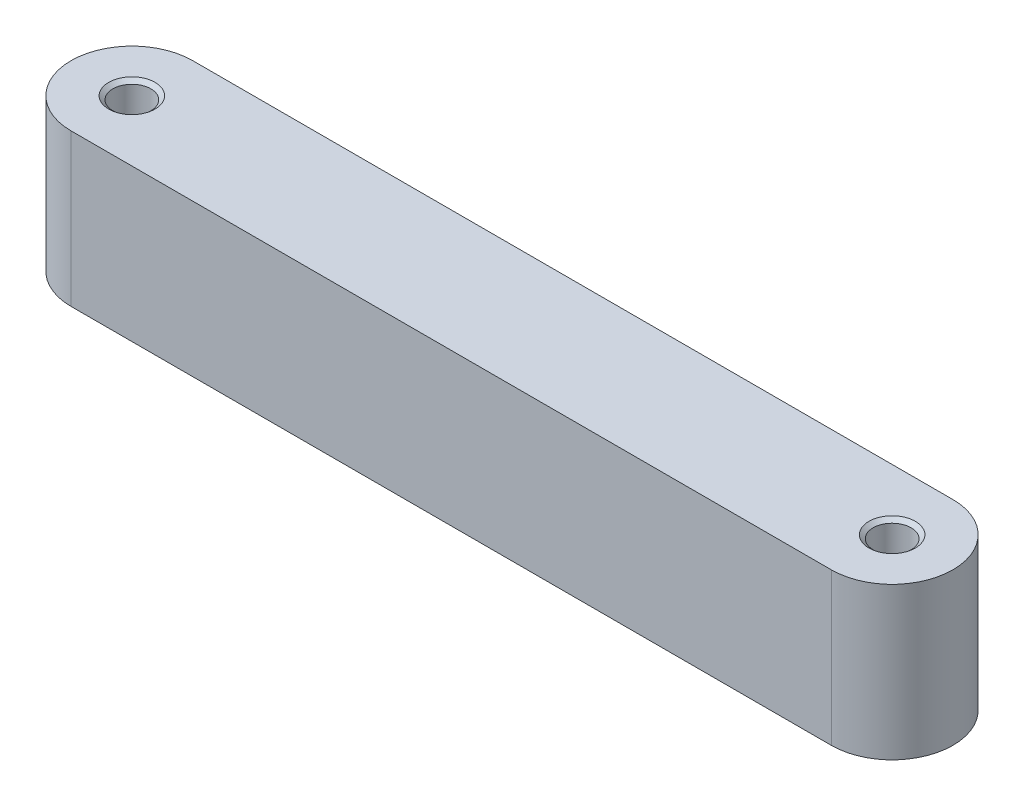
ISO-10303-21;
HEADER;
FILE_DESCRIPTION(('STEP AP214'),'2;1');
FILE_NAME('part.step','',(''),(''),'','','');
FILE_SCHEMA(('AUTOMOTIVE_DESIGN { 1 0 10303 214 1 1 1 1 }'));
ENDSEC;
DATA;
#1=APPLICATION_CONTEXT('core data for automotive mechanical design processes');
#2=APPLICATION_PROTOCOL_DEFINITION('international standard','automotive_design',2000,#1);
#3=PRODUCT_CONTEXT('',#1,'mechanical');
#4=PRODUCT('Part','Part','',(#3));
#5=PRODUCT_RELATED_PRODUCT_CATEGORY('part','',(#4));
#6=PRODUCT_DEFINITION_FORMATION('','',#4);
#7=PRODUCT_DEFINITION_CONTEXT('part definition',#1,'design');
#8=PRODUCT_DEFINITION('design','',#6,#7);
#9=PRODUCT_DEFINITION_SHAPE('','',#8);
#10=(LENGTH_UNIT() NAMED_UNIT(*) SI_UNIT(.MILLI.,.METRE.));
#11=(NAMED_UNIT(*) PLANE_ANGLE_UNIT() SI_UNIT($,.RADIAN.));
#12=(NAMED_UNIT(*) SI_UNIT($,.STERADIAN.) SOLID_ANGLE_UNIT());
#13=UNCERTAINTY_MEASURE_WITH_UNIT(LENGTH_MEASURE(1.E-05),#10,'distance_accuracy_value','');
#14=(GEOMETRIC_REPRESENTATION_CONTEXT(3) GLOBAL_UNCERTAINTY_ASSIGNED_CONTEXT((#13)) GLOBAL_UNIT_ASSIGNED_CONTEXT((#10,
#11,#12)) REPRESENTATION_CONTEXT('',''));
#15=CARTESIAN_POINT('',(0.,0.,0.));
#16=DIRECTION('',(0.,0.,1.));
#17=DIRECTION('',(1.,0.,0.));
#18=AXIS2_PLACEMENT_3D('',#15,#16,#17);
#19=CARTESIAN_POINT('',(-25.,10.,0.));
#20=DIRECTION('',(0.,-1.,0.));
#21=DIRECTION('',(0.,0.,-1.));
#22=AXIS2_PLACEMENT_3D('',#19,#20,#21);
#23=CYLINDRICAL_SURFACE('',#22,4.);
#24=CARTESIAN_POINT('',(-25.,0.,0.));
#25=DIRECTION('',(0.,1.,0.));
#26=DIRECTION('',(0.,0.,1.));
#27=AXIS2_PLACEMENT_3D('',#24,#25,#26);
#28=CIRCLE('',#27,4.);
#29=CARTESIAN_POINT('',(-25.,0.,-4.));
#30=VERTEX_POINT('',#29);
#31=CARTESIAN_POINT('',(-25.,0.,4.));
#32=VERTEX_POINT('',#31);
#33=EDGE_CURVE('E117',#30,#32,#28,.T.);
#34=ORIENTED_EDGE('',*,*,#33,.T.);
#35=DIRECTION('',(0.,-1.,0.));
#36=VECTOR('',#35,1.);
#37=CARTESIAN_POINT('',(-25.,10.,4.));
#38=LINE('',#37,#36);
#39=CARTESIAN_POINT('',(-25.,10.,4.));
#40=VERTEX_POINT('',#39);
#41=EDGE_CURVE('E11',#40,#32,#38,.T.);
#42=ORIENTED_EDGE('',*,*,#41,.F.);
#43=CARTESIAN_POINT('',(-25.,10.,0.));
#44=DIRECTION('',(0.,1.,0.));
#45=DIRECTION('',(0.,0.,1.));
#46=AXIS2_PLACEMENT_3D('',#43,#44,#45);
#47=CIRCLE('',#46,4.);
#48=CARTESIAN_POINT('',(-25.,10.,-4.));
#49=VERTEX_POINT('',#48);
#50=EDGE_CURVE('E101',#49,#40,#47,.T.);
#51=ORIENTED_EDGE('',*,*,#50,.F.);
#52=DIRECTION('',(0.,-1.,0.));
#53=VECTOR('',#52,1.);
#54=CARTESIAN_POINT('',(-25.,10.,-4.));
#55=LINE('',#54,#53);
#56=EDGE_CURVE('E113',#49,#30,#55,.T.);
#57=ORIENTED_EDGE('',*,*,#56,.T.);
#58=EDGE_LOOP('',(#34,#42,#51,#57));
#59=FACE_BOUND('',#58,.T.);
#60=ADVANCED_FACE('F49',(#59),#23,.T.);
#61=CARTESIAN_POINT('',(-25.,10.,4.));
#62=DIRECTION('',(0.,0.,-1.));
#63=DIRECTION('',(-1.,0.,0.));
#64=AXIS2_PLACEMENT_3D('',#61,#62,#63);
#65=PLANE('',#64);
#66=DIRECTION('',(1.,0.,0.));
#67=VECTOR('',#66,1.);
#68=CARTESIAN_POINT('',(-25.,0.,4.));
#69=LINE('',#68,#67);
#70=CARTESIAN_POINT('',(25.,0.,4.));
#71=VERTEX_POINT('',#70);
#72=EDGE_CURVE('E106',#32,#71,#69,.T.);
#73=ORIENTED_EDGE('',*,*,#72,.T.);
#74=DIRECTION('',(0.,-1.,0.));
#75=VECTOR('',#74,1.);
#76=CARTESIAN_POINT('',(25.,10.,4.));
#77=LINE('',#76,#75);
#78=CARTESIAN_POINT('',(25.,10.,4.));
#79=VERTEX_POINT('',#78);
#80=EDGE_CURVE('E58',#79,#71,#77,.T.);
#81=ORIENTED_EDGE('',*,*,#80,.F.);
#82=DIRECTION('',(1.,0.,0.));
#83=VECTOR('',#82,1.);
#84=CARTESIAN_POINT('',(-25.,10.,4.));
#85=LINE('',#84,#83);
#86=EDGE_CURVE('E96',#40,#79,#85,.T.);
#87=ORIENTED_EDGE('',*,*,#86,.F.);
#88=ORIENTED_EDGE('',*,*,#41,.T.);
#89=EDGE_LOOP('',(#73,#81,#87,#88));
#90=FACE_BOUND('',#89,.T.);
#91=ADVANCED_FACE('F105',(#90),#65,.F.);
#92=CARTESIAN_POINT('',(25.,10.,0.));
#93=DIRECTION('',(0.,-1.,0.));
#94=DIRECTION('',(0.,0.,-1.));
#95=AXIS2_PLACEMENT_3D('',#92,#93,#94);
#96=CYLINDRICAL_SURFACE('',#95,4.);
#97=CARTESIAN_POINT('',(25.,0.,0.));
#98=DIRECTION('',(0.,1.,0.));
#99=DIRECTION('',(0.,0.,1.));
#100=AXIS2_PLACEMENT_3D('',#97,#98,#99);
#101=CIRCLE('',#100,4.);
#102=CARTESIAN_POINT('',(25.,0.,-4.));
#103=VERTEX_POINT('',#102);
#104=EDGE_CURVE('E83',#71,#103,#101,.T.);
#105=ORIENTED_EDGE('',*,*,#104,.T.);
#106=DIRECTION('',(0.,-1.,0.));
#107=VECTOR('',#106,1.);
#108=CARTESIAN_POINT('',(25.,10.,-4.));
#109=LINE('',#108,#107);
#110=CARTESIAN_POINT('',(25.,10.,-4.));
#111=VERTEX_POINT('',#110);
#112=EDGE_CURVE('E108',#111,#103,#109,.T.);
#113=ORIENTED_EDGE('',*,*,#112,.F.);
#114=CARTESIAN_POINT('',(25.,10.,0.));
#115=DIRECTION('',(0.,1.,0.));
#116=DIRECTION('',(0.,0.,1.));
#117=AXIS2_PLACEMENT_3D('',#114,#115,#116);
#118=CIRCLE('',#117,4.);
#119=EDGE_CURVE('E99',#79,#111,#118,.T.);
#120=ORIENTED_EDGE('',*,*,#119,.F.);
#121=ORIENTED_EDGE('',*,*,#80,.T.);
#122=EDGE_LOOP('',(#105,#113,#120,#121));
#123=FACE_BOUND('',#122,.T.);
#124=ADVANCED_FACE('F109',(#123),#96,.T.);
#125=CARTESIAN_POINT('',(-25.,10.,-4.));
#126=DIRECTION('',(0.,0.,1.));
#127=DIRECTION('',(1.,0.,0.));
#128=AXIS2_PLACEMENT_3D('',#125,#126,#127);
#129=PLANE('',#128);
#130=DIRECTION('',(-1.,0.,0.));
#131=VECTOR('',#130,1.);
#132=CARTESIAN_POINT('',(-25.,0.,-4.));
#133=LINE('',#132,#131);
#134=EDGE_CURVE('E89',#103,#30,#133,.T.);
#135=ORIENTED_EDGE('',*,*,#134,.T.);
#136=ORIENTED_EDGE('',*,*,#56,.F.);
#137=DIRECTION('',(-1.,0.,0.));
#138=VECTOR('',#137,1.);
#139=CARTESIAN_POINT('',(-25.,10.,-4.));
#140=LINE('',#139,#138);
#141=EDGE_CURVE('E66',#111,#49,#140,.T.);
#142=ORIENTED_EDGE('',*,*,#141,.F.);
#143=ORIENTED_EDGE('',*,*,#112,.T.);
#144=EDGE_LOOP('',(#135,#136,#142,#143));
#145=FACE_BOUND('',#144,.T.);
#146=ADVANCED_FACE('F131',(#145),#129,.F.);
#147=CARTESIAN_POINT('',(-25.,10.,0.));
#148=DIRECTION('',(0.,1.,0.));
#149=DIRECTION('',(0.,0.,1.));
#150=AXIS2_PLACEMENT_3D('',#147,#148,#149);
#151=PLANE('',#150);
#152=CARTESIAN_POINT('',(25.,10.,0.));
#153=DIRECTION('',(0.,1.,0.));
#154=DIRECTION('',(0.,0.,1.));
#155=AXIS2_PLACEMENT_3D('',#152,#153,#154);
#156=CIRCLE('',#155,1.525);
#157=CARTESIAN_POINT('',(25.,10.,1.525));
#158=VERTEX_POINT('',#157);
#159=EDGE_CURVE('E157',#158,#158,#156,.T.);
#160=ORIENTED_EDGE('',*,*,#159,.F.);
#161=EDGE_LOOP('',(#160));
#162=FACE_BOUND('',#161,.T.);
#163=CARTESIAN_POINT('',(-25.,10.,0.));
#164=DIRECTION('',(0.,1.,0.));
#165=DIRECTION('',(0.,0.,1.));
#166=AXIS2_PLACEMENT_3D('',#163,#164,#165);
#167=CIRCLE('',#166,1.525);
#168=CARTESIAN_POINT('',(-25.,10.,1.52500000000001));
#169=VERTEX_POINT('',#168);
#170=EDGE_CURVE('E145',#169,#169,#167,.T.);
#171=ORIENTED_EDGE('',*,*,#170,.F.);
#172=EDGE_LOOP('',(#171));
#173=FACE_BOUND('',#172,.T.);
#174=ORIENTED_EDGE('',*,*,#50,.T.);
#175=ORIENTED_EDGE('',*,*,#86,.T.);
#176=ORIENTED_EDGE('',*,*,#119,.T.);
#177=ORIENTED_EDGE('',*,*,#141,.T.);
#178=EDGE_LOOP('',(#174,#175,#176,#177));
#179=FACE_BOUND('',#178,.T.);
#180=ADVANCED_FACE('F97',(#162,#173,#179),#151,.T.);
#181=CARTESIAN_POINT('',(-25.,0.,0.));
#182=DIRECTION('',(0.,1.,0.));
#183=DIRECTION('',(0.,0.,1.));
#184=AXIS2_PLACEMENT_3D('',#181,#182,#183);
#185=PLANE('',#184);
#186=CARTESIAN_POINT('',(25.,0.,0.));
#187=DIRECTION('',(0.,1.,0.));
#188=DIRECTION('',(0.,0.,1.));
#189=AXIS2_PLACEMENT_3D('',#186,#187,#188);
#190=CIRCLE('',#189,1.25);
#191=CARTESIAN_POINT('',(25.,0.,1.25));
#192=VERTEX_POINT('',#191);
#193=EDGE_CURVE('E149',#192,#192,#190,.T.);
#194=ORIENTED_EDGE('',*,*,#193,.T.);
#195=EDGE_LOOP('',(#194));
#196=FACE_BOUND('',#195,.T.);
#197=CARTESIAN_POINT('',(-25.,0.,0.));
#198=DIRECTION('',(0.,1.,0.));
#199=DIRECTION('',(0.,0.,1.));
#200=AXIS2_PLACEMENT_3D('',#197,#198,#199);
#201=CIRCLE('',#200,1.25);
#202=CARTESIAN_POINT('',(-25.,0.,1.25000000000001));
#203=VERTEX_POINT('',#202);
#204=EDGE_CURVE('E121',#203,#203,#201,.T.);
#205=ORIENTED_EDGE('',*,*,#204,.T.);
#206=EDGE_LOOP('',(#205));
#207=FACE_BOUND('',#206,.T.);
#208=ORIENTED_EDGE('',*,*,#33,.F.);
#209=ORIENTED_EDGE('',*,*,#134,.F.);
#210=ORIENTED_EDGE('',*,*,#104,.F.);
#211=ORIENTED_EDGE('',*,*,#72,.F.);
#212=EDGE_LOOP('',(#208,#209,#210,#211));
#213=FACE_BOUND('',#212,.T.);
#214=ADVANCED_FACE('F134',(#196,#207,#213),#185,.F.);
#215=CARTESIAN_POINT('',(-25.,10.,0.));
#216=DIRECTION('',(0.,1.,0.));
#217=DIRECTION('',(0.,0.,1.));
#218=AXIS2_PLACEMENT_3D('',#215,#216,#217);
#219=CYLINDRICAL_SURFACE('',#218,1.25);
#220=ORIENTED_EDGE('',*,*,#204,.F.);
#221=EDGE_LOOP('',(#220));
#222=FACE_BOUND('',#221,.T.);
#223=CARTESIAN_POINT('',(-25.,9.76924760142625,0.));
#224=DIRECTION('',(0.,1.,0.));
#225=DIRECTION('',(0.,0.,1.));
#226=AXIS2_PLACEMENT_3D('',#223,#224,#225);
#227=CIRCLE('',#226,1.25);
#228=CARTESIAN_POINT('',(-25.,9.76924760142625,1.25000000000001));
#229=VERTEX_POINT('',#228);
#230=EDGE_CURVE('E141',#229,#229,#227,.T.);
#231=ORIENTED_EDGE('',*,*,#230,.T.);
#232=EDGE_LOOP('',(#231));
#233=FACE_BOUND('',#232,.T.);
#234=ADVANCED_FACE('F172',(#222,#233),#219,.F.);
#235=CARTESIAN_POINT('',(-25.,10.,0.));
#236=DIRECTION('',(0.,1.,0.));
#237=DIRECTION('',(0.,0.,1.));
#238=AXIS2_PLACEMENT_3D('',#235,#236,#237);
#239=CONICAL_SURFACE('',#238,1.525,0.872664625997158);
#240=ORIENTED_EDGE('',*,*,#230,.F.);
#241=EDGE_LOOP('',(#240));
#242=FACE_BOUND('',#241,.T.);
#243=ORIENTED_EDGE('',*,*,#170,.T.);
#244=EDGE_LOOP('',(#243));
#245=FACE_BOUND('',#244,.T.);
#246=ADVANCED_FACE('F169',(#242,#245),#239,.F.);
#247=CARTESIAN_POINT('',(25.,10.,0.));
#248=DIRECTION('',(0.,1.,0.));
#249=DIRECTION('',(0.,0.,1.));
#250=AXIS2_PLACEMENT_3D('',#247,#248,#249);
#251=CYLINDRICAL_SURFACE('',#250,1.25);
#252=ORIENTED_EDGE('',*,*,#193,.F.);
#253=EDGE_LOOP('',(#252));
#254=FACE_BOUND('',#253,.T.);
#255=CARTESIAN_POINT('',(25.,9.76924760142625,0.));
#256=DIRECTION('',(0.,1.,0.));
#257=DIRECTION('',(0.,0.,1.));
#258=AXIS2_PLACEMENT_3D('',#255,#256,#257);
#259=CIRCLE('',#258,1.25);
#260=CARTESIAN_POINT('',(25.,9.76924760142625,1.25));
#261=VERTEX_POINT('',#260);
#262=EDGE_CURVE('E153',#261,#261,#259,.T.);
#263=ORIENTED_EDGE('',*,*,#262,.T.);
#264=EDGE_LOOP('',(#263));
#265=FACE_BOUND('',#264,.T.);
#266=ADVANCED_FACE('F171',(#254,#265),#251,.F.);
#267=CARTESIAN_POINT('',(25.,10.,0.));
#268=DIRECTION('',(0.,1.,0.));
#269=DIRECTION('',(0.,0.,1.));
#270=AXIS2_PLACEMENT_3D('',#267,#268,#269);
#271=CONICAL_SURFACE('',#270,1.525,0.872664625997158);
#272=ORIENTED_EDGE('',*,*,#262,.F.);
#273=EDGE_LOOP('',(#272));
#274=FACE_BOUND('',#273,.T.);
#275=ORIENTED_EDGE('',*,*,#159,.T.);
#276=EDGE_LOOP('',(#275));
#277=FACE_BOUND('',#276,.T.);
#278=ADVANCED_FACE('F162',(#274,#277),#271,.F.);
#279=CLOSED_SHELL('',(#60,#91,#124,#146,#180,#214,#234,#246,#266,#278));
#280=MANIFOLD_SOLID_BREP('B2',#279);
#281=ADVANCED_BREP_SHAPE_REPRESENTATION('',(#18,#280),#14);
#282=SHAPE_DEFINITION_REPRESENTATION(#9,#281);
ENDSEC;
END-ISO-10303-21;
